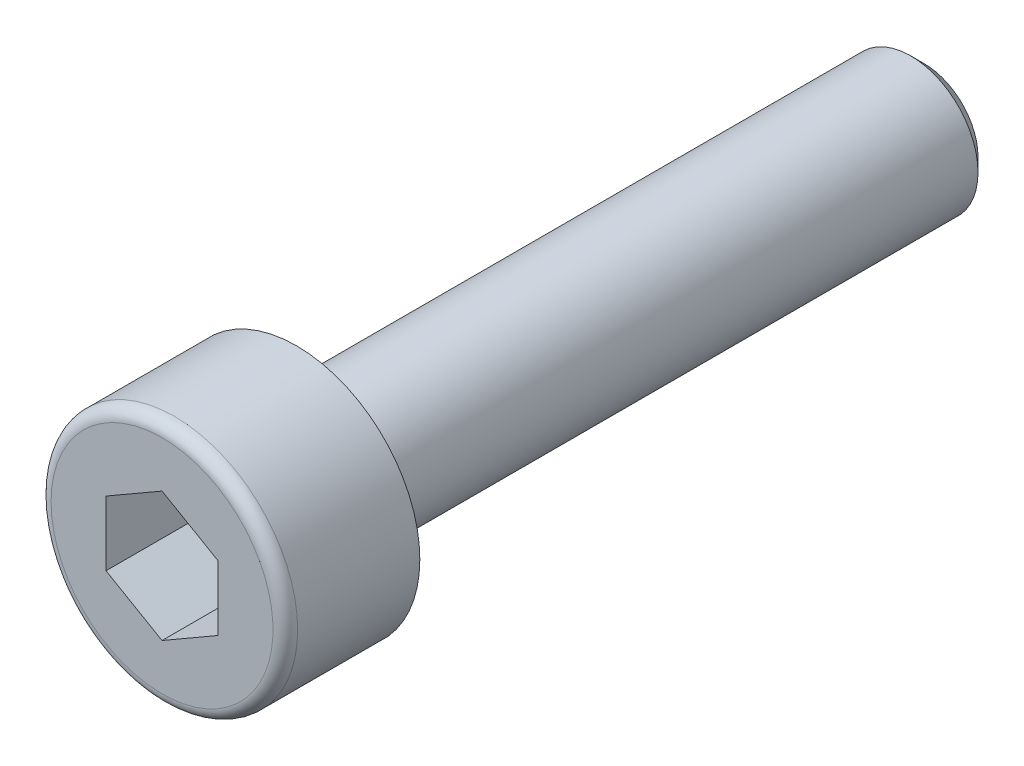
ISO-10303-21;
HEADER;
FILE_DESCRIPTION(('STEP AP214'),'2;1');
FILE_NAME('part.step','',(''),(''),'','','');
FILE_SCHEMA(('AUTOMOTIVE_DESIGN { 1 0 10303 214 1 1 1 1 }'));
ENDSEC;
DATA;
#1=APPLICATION_CONTEXT('core data for automotive mechanical design processes');
#2=APPLICATION_PROTOCOL_DEFINITION('international standard','automotive_design',2000,#1);
#3=PRODUCT_CONTEXT('',#1,'mechanical');
#4=PRODUCT('Part','Part','',(#3));
#5=PRODUCT_RELATED_PRODUCT_CATEGORY('part','',(#4));
#6=PRODUCT_DEFINITION_FORMATION('','',#4);
#7=PRODUCT_DEFINITION_CONTEXT('part definition',#1,'design');
#8=PRODUCT_DEFINITION('design','',#6,#7);
#9=PRODUCT_DEFINITION_SHAPE('','',#8);
#10=(LENGTH_UNIT() NAMED_UNIT(*) SI_UNIT(.MILLI.,.METRE.));
#11=(NAMED_UNIT(*) PLANE_ANGLE_UNIT() SI_UNIT($,.RADIAN.));
#12=(NAMED_UNIT(*) SI_UNIT($,.STERADIAN.) SOLID_ANGLE_UNIT());
#13=UNCERTAINTY_MEASURE_WITH_UNIT(LENGTH_MEASURE(1.E-05),#10,'distance_accuracy_value','');
#14=(GEOMETRIC_REPRESENTATION_CONTEXT(3) GLOBAL_UNCERTAINTY_ASSIGNED_CONTEXT((#13)) GLOBAL_UNIT_ASSIGNED_CONTEXT((#10,
#11,#12)) REPRESENTATION_CONTEXT('',''));
#15=CARTESIAN_POINT('',(0.,0.,0.));
#16=DIRECTION('',(0.,0.,1.));
#17=DIRECTION('',(1.,0.,0.));
#18=AXIS2_PLACEMENT_3D('',#15,#16,#17);
#19=CARTESIAN_POINT('',(0.,0.,3.));
#20=DIRECTION('',(0.,0.,-1.));
#21=DIRECTION('',(-1.,0.,0.));
#22=AXIS2_PLACEMENT_3D('',#19,#20,#21);
#23=PLANE('',#22);
#24=CARTESIAN_POINT('',(0.,0.,3.));
#25=DIRECTION('',(0.,0.,-1.));
#26=DIRECTION('',(-1.,0.,0.));
#27=AXIS2_PLACEMENT_3D('',#24,#25,#26);
#28=CIRCLE('',#27,2.475);
#29=CARTESIAN_POINT('',(-2.475,0.,3.));
#30=VERTEX_POINT('',#29);
#31=EDGE_CURVE('E177',#30,#30,#28,.F.);
#32=ORIENTED_EDGE('',*,*,#31,.T.);
#33=EDGE_LOOP('',(#32));
#34=FACE_BOUND('',#33,.T.);
#35=DIRECTION('',(-0.866025403784439,-0.5,0.));
#36=VECTOR('',#35,1.);
#37=CARTESIAN_POINT('',(0.,1.44337567297406,3.));
#38=LINE('',#37,#36);
#39=CARTESIAN_POINT('',(0.,1.44337567297406,3.));
#40=VERTEX_POINT('',#39);
#41=CARTESIAN_POINT('',(-1.25,0.721687836487032,3.));
#42=VERTEX_POINT('',#41);
#43=EDGE_CURVE('E141',#40,#42,#38,.T.);
#44=ORIENTED_EDGE('',*,*,#43,.F.);
#45=DIRECTION('',(-0.866025403784439,0.5,0.));
#46=VECTOR('',#45,1.);
#47=CARTESIAN_POINT('',(1.25,0.721687836487032,3.));
#48=LINE('',#47,#46);
#49=CARTESIAN_POINT('',(1.25,0.721687836487032,3.));
#50=VERTEX_POINT('',#49);
#51=EDGE_CURVE('E61',#50,#40,#48,.T.);
#52=ORIENTED_EDGE('',*,*,#51,.F.);
#53=DIRECTION('',(0.,1.,0.));
#54=VECTOR('',#53,1.);
#55=CARTESIAN_POINT('',(1.25,-0.721687836487032,3.));
#56=LINE('',#55,#54);
#57=CARTESIAN_POINT('',(1.25,-0.721687836487032,3.));
#58=VERTEX_POINT('',#57);
#59=EDGE_CURVE('E154',#58,#50,#56,.T.);
#60=ORIENTED_EDGE('',*,*,#59,.F.);
#61=DIRECTION('',(0.866025403784439,0.5,0.));
#62=VECTOR('',#61,1.);
#63=CARTESIAN_POINT('',(0.,-1.44337567297406,3.));
#64=LINE('',#63,#62);
#65=CARTESIAN_POINT('',(0.,-1.44337567297406,3.));
#66=VERTEX_POINT('',#65);
#67=EDGE_CURVE('E151',#66,#58,#64,.T.);
#68=ORIENTED_EDGE('',*,*,#67,.F.);
#69=DIRECTION('',(0.866025403784439,-0.5,0.));
#70=VECTOR('',#69,1.);
#71=CARTESIAN_POINT('',(-1.25,-0.721687836487033,3.));
#72=LINE('',#71,#70);
#73=CARTESIAN_POINT('',(-1.25,-0.721687836487033,3.));
#74=VERTEX_POINT('',#73);
#75=EDGE_CURVE('E109',#74,#66,#72,.T.);
#76=ORIENTED_EDGE('',*,*,#75,.F.);
#77=DIRECTION('',(0.,-1.,0.));
#78=VECTOR('',#77,1.);
#79=CARTESIAN_POINT('',(-1.25,0.721687836487032,3.));
#80=LINE('',#79,#78);
#81=EDGE_CURVE('E145',#42,#74,#80,.T.);
#82=ORIENTED_EDGE('',*,*,#81,.F.);
#83=EDGE_LOOP('',(#44,#52,#60,#68,#76,#82));
#84=FACE_BOUND('',#83,.T.);
#85=ADVANCED_FACE('F45',(#34,#84),#23,.F.);
#86=CARTESIAN_POINT('',(0.,0.,3.));
#87=DIRECTION('',(0.,0.,1.));
#88=DIRECTION('',(1.,0.,0.));
#89=AXIS2_PLACEMENT_3D('',#86,#87,#88);
#90=CYLINDRICAL_SURFACE('',#89,2.75);
#91=CARTESIAN_POINT('',(0.,0.,2.725));
#92=DIRECTION('',(0.,0.,-1.));
#93=DIRECTION('',(-1.,0.,0.));
#94=AXIS2_PLACEMENT_3D('',#91,#92,#93);
#95=CIRCLE('',#94,2.75);
#96=CARTESIAN_POINT('',(-2.75,0.,2.725));
#97=VERTEX_POINT('',#96);
#98=EDGE_CURVE('E181',#97,#97,#95,.T.);
#99=ORIENTED_EDGE('',*,*,#98,.T.);
#100=EDGE_LOOP('',(#99));
#101=FACE_BOUND('',#100,.T.);
#102=CARTESIAN_POINT('',(0.,0.,0.));
#103=DIRECTION('',(0.,0.,1.));
#104=DIRECTION('',(1.,0.,0.));
#105=AXIS2_PLACEMENT_3D('',#102,#103,#104);
#106=CIRCLE('',#105,2.75);
#107=CARTESIAN_POINT('',(2.75,0.,0.));
#108=VERTEX_POINT('',#107);
#109=EDGE_CURVE('E173',#108,#108,#106,.T.);
#110=ORIENTED_EDGE('',*,*,#109,.T.);
#111=EDGE_LOOP('',(#110));
#112=FACE_BOUND('',#111,.T.);
#113=ADVANCED_FACE('F201',(#101,#112),#90,.T.);
#114=CARTESIAN_POINT('',(0.,2.75,0.));
#115=DIRECTION('',(0.,0.,1.));
#116=DIRECTION('',(1.,0.,0.));
#117=AXIS2_PLACEMENT_3D('',#114,#115,#116);
#118=PLANE('',#117);
#119=ORIENTED_EDGE('',*,*,#109,.F.);
#120=EDGE_LOOP('',(#119));
#121=FACE_BOUND('',#120,.T.);
#122=CARTESIAN_POINT('',(0.,0.,0.));
#123=DIRECTION('',(0.,0.,1.));
#124=DIRECTION('',(1.,0.,0.));
#125=AXIS2_PLACEMENT_3D('',#122,#123,#124);
#126=CIRCLE('',#125,1.5);
#127=CARTESIAN_POINT('',(1.5,0.,0.));
#128=VERTEX_POINT('',#127);
#129=EDGE_CURVE('E160',#128,#128,#126,.T.);
#130=ORIENTED_EDGE('',*,*,#129,.T.);
#131=EDGE_LOOP('',(#130));
#132=FACE_BOUND('',#131,.T.);
#133=ADVANCED_FACE('F208',(#121,#132),#118,.F.);
#134=CARTESIAN_POINT('',(0.,0.,3.));
#135=DIRECTION('',(0.,0.,1.));
#136=DIRECTION('',(1.,0.,0.));
#137=AXIS2_PLACEMENT_3D('',#134,#135,#136);
#138=CYLINDRICAL_SURFACE('',#137,1.5);
#139=CARTESIAN_POINT('',(0.,0.,-13.7));
#140=DIRECTION('',(0.,0.,1.));
#141=DIRECTION('',(1.,0.,0.));
#142=AXIS2_PLACEMENT_3D('',#139,#140,#141);
#143=CIRCLE('',#142,1.5);
#144=CARTESIAN_POINT('',(1.5,0.,-13.7));
#145=VERTEX_POINT('',#144);
#146=EDGE_CURVE('E54',#145,#145,#143,.T.);
#147=ORIENTED_EDGE('',*,*,#146,.T.);
#148=EDGE_LOOP('',(#147));
#149=FACE_BOUND('',#148,.T.);
#150=ORIENTED_EDGE('',*,*,#129,.F.);
#151=EDGE_LOOP('',(#150));
#152=FACE_BOUND('',#151,.T.);
#153=ADVANCED_FACE('F188',(#149,#152),#138,.T.);
#154=CARTESIAN_POINT('',(0.,1.5,-14.));
#155=DIRECTION('',(0.,0.,1.));
#156=DIRECTION('',(1.,0.,0.));
#157=AXIS2_PLACEMENT_3D('',#154,#155,#156);
#158=PLANE('',#157);
#159=CARTESIAN_POINT('',(0.,0.,-14.));
#160=DIRECTION('',(0.,0.,1.));
#161=DIRECTION('',(1.,0.,0.));
#162=AXIS2_PLACEMENT_3D('',#159,#160,#161);
#163=CIRCLE('',#162,1.2);
#164=CARTESIAN_POINT('',(1.2,0.,-14.));
#165=VERTEX_POINT('',#164);
#166=EDGE_CURVE('E11',#165,#165,#163,.F.);
#167=ORIENTED_EDGE('',*,*,#166,.T.);
#168=EDGE_LOOP('',(#167));
#169=FACE_BOUND('',#168,.T.);
#170=ADVANCED_FACE('F218',(#169),#158,.F.);
#171=CARTESIAN_POINT('',(1.25,0.721687836487032,1.075));
#172=DIRECTION('',(0.5,0.866025403784439,0.));
#173=DIRECTION('',(-0.866025403784439,0.5,0.));
#174=AXIS2_PLACEMENT_3D('',#171,#172,#173);
#175=PLANE('',#174);
#176=ORIENTED_EDGE('',*,*,#51,.T.);
#177=DIRECTION('',(0.,0.,1.));
#178=VECTOR('',#177,1.);
#179=CARTESIAN_POINT('',(0.,1.44337567297406,1.075));
#180=LINE('',#179,#178);
#181=CARTESIAN_POINT('',(0.,1.44337567297406,1.075));
#182=VERTEX_POINT('',#181);
#183=EDGE_CURVE('E91',#182,#40,#180,.T.);
#184=ORIENTED_EDGE('',*,*,#183,.F.);
#185=DIRECTION('',(-0.866025403784439,0.5,0.));
#186=VECTOR('',#185,1.);
#187=CARTESIAN_POINT('',(1.25,0.721687836487032,1.075));
#188=LINE('',#187,#186);
#189=CARTESIAN_POINT('',(1.25,0.721687836487032,1.075));
#190=VERTEX_POINT('',#189);
#191=EDGE_CURVE('E157',#190,#182,#188,.T.);
#192=ORIENTED_EDGE('',*,*,#191,.F.);
#193=DIRECTION('',(0.,0.,1.));
#194=VECTOR('',#193,1.);
#195=CARTESIAN_POINT('',(1.25,0.721687836487032,1.075));
#196=LINE('',#195,#194);
#197=EDGE_CURVE('E69',#190,#50,#196,.T.);
#198=ORIENTED_EDGE('',*,*,#197,.T.);
#199=EDGE_LOOP('',(#176,#184,#192,#198));
#200=FACE_BOUND('',#199,.T.);
#201=ADVANCED_FACE('F220',(#200),#175,.F.);
#202=CARTESIAN_POINT('',(1.25,-0.721687836487032,1.075));
#203=DIRECTION('',(1.,0.,0.));
#204=DIRECTION('',(0.,0.,-1.));
#205=AXIS2_PLACEMENT_3D('',#202,#203,#204);
#206=PLANE('',#205);
#207=ORIENTED_EDGE('',*,*,#59,.T.);
#208=ORIENTED_EDGE('',*,*,#197,.F.);
#209=DIRECTION('',(0.,1.,0.));
#210=VECTOR('',#209,1.);
#211=CARTESIAN_POINT('',(1.25,-0.721687836487032,1.075));
#212=LINE('',#211,#210);
#213=CARTESIAN_POINT('',(1.25,-0.721687836487032,1.075));
#214=VERTEX_POINT('',#213);
#215=EDGE_CURVE('E123',#214,#190,#212,.T.);
#216=ORIENTED_EDGE('',*,*,#215,.F.);
#217=DIRECTION('',(0.,0.,1.));
#218=VECTOR('',#217,1.);
#219=CARTESIAN_POINT('',(1.25,-0.721687836487032,1.075));
#220=LINE('',#219,#218);
#221=EDGE_CURVE('E114',#214,#58,#220,.T.);
#222=ORIENTED_EDGE('',*,*,#221,.T.);
#223=EDGE_LOOP('',(#207,#208,#216,#222));
#224=FACE_BOUND('',#223,.T.);
#225=ADVANCED_FACE('F224',(#224),#206,.F.);
#226=CARTESIAN_POINT('',(0.,-1.44337567297406,1.075));
#227=DIRECTION('',(0.5,-0.866025403784439,0.));
#228=DIRECTION('',(0.866025403784439,0.5,0.));
#229=AXIS2_PLACEMENT_3D('',#226,#227,#228);
#230=PLANE('',#229);
#231=ORIENTED_EDGE('',*,*,#67,.T.);
#232=ORIENTED_EDGE('',*,*,#221,.F.);
#233=DIRECTION('',(0.866025403784439,0.5,0.));
#234=VECTOR('',#233,1.);
#235=CARTESIAN_POINT('',(0.,-1.44337567297406,1.075));
#236=LINE('',#235,#234);
#237=CARTESIAN_POINT('',(0.,-1.44337567297406,1.075));
#238=VERTEX_POINT('',#237);
#239=EDGE_CURVE('E118',#238,#214,#236,.T.);
#240=ORIENTED_EDGE('',*,*,#239,.F.);
#241=DIRECTION('',(0.,0.,1.));
#242=VECTOR('',#241,1.);
#243=CARTESIAN_POINT('',(0.,-1.44337567297406,1.075));
#244=LINE('',#243,#242);
#245=EDGE_CURVE('E102',#238,#66,#244,.T.);
#246=ORIENTED_EDGE('',*,*,#245,.T.);
#247=EDGE_LOOP('',(#231,#232,#240,#246));
#248=FACE_BOUND('',#247,.T.);
#249=ADVANCED_FACE('F119',(#248),#230,.F.);
#250=CARTESIAN_POINT('',(-1.25,-0.721687836487033,1.075));
#251=DIRECTION('',(-0.5,-0.866025403784439,0.));
#252=DIRECTION('',(0.866025403784439,-0.5,0.));
#253=AXIS2_PLACEMENT_3D('',#250,#251,#252);
#254=PLANE('',#253);
#255=ORIENTED_EDGE('',*,*,#75,.T.);
#256=ORIENTED_EDGE('',*,*,#245,.F.);
#257=DIRECTION('',(0.866025403784439,-0.5,0.));
#258=VECTOR('',#257,1.);
#259=CARTESIAN_POINT('',(-1.25,-0.721687836487033,1.075));
#260=LINE('',#259,#258);
#261=CARTESIAN_POINT('',(-1.25,-0.721687836487033,1.075));
#262=VERTEX_POINT('',#261);
#263=EDGE_CURVE('E106',#262,#238,#260,.T.);
#264=ORIENTED_EDGE('',*,*,#263,.F.);
#265=DIRECTION('',(0.,0.,1.));
#266=VECTOR('',#265,1.);
#267=CARTESIAN_POINT('',(-1.25,-0.721687836487033,1.075));
#268=LINE('',#267,#266);
#269=EDGE_CURVE('E115',#262,#74,#268,.T.);
#270=ORIENTED_EDGE('',*,*,#269,.T.);
#271=EDGE_LOOP('',(#255,#256,#264,#270));
#272=FACE_BOUND('',#271,.T.);
#273=ADVANCED_FACE('F104',(#272),#254,.F.);
#274=CARTESIAN_POINT('',(-1.25,0.721687836487032,1.075));
#275=DIRECTION('',(-1.,0.,0.));
#276=DIRECTION('',(0.,-1.,0.));
#277=AXIS2_PLACEMENT_3D('',#274,#275,#276);
#278=PLANE('',#277);
#279=ORIENTED_EDGE('',*,*,#81,.T.);
#280=ORIENTED_EDGE('',*,*,#269,.F.);
#281=DIRECTION('',(0.,-1.,0.));
#282=VECTOR('',#281,1.);
#283=CARTESIAN_POINT('',(-1.25,0.721687836487032,1.075));
#284=LINE('',#283,#282);
#285=CARTESIAN_POINT('',(-1.25,0.721687836487032,1.075));
#286=VERTEX_POINT('',#285);
#287=EDGE_CURVE('E129',#286,#262,#284,.T.);
#288=ORIENTED_EDGE('',*,*,#287,.F.);
#289=DIRECTION('',(0.,0.,1.));
#290=VECTOR('',#289,1.);
#291=CARTESIAN_POINT('',(-1.25,0.721687836487032,1.075));
#292=LINE('',#291,#290);
#293=EDGE_CURVE('E165',#286,#42,#292,.T.);
#294=ORIENTED_EDGE('',*,*,#293,.T.);
#295=EDGE_LOOP('',(#279,#280,#288,#294));
#296=FACE_BOUND('',#295,.T.);
#297=ADVANCED_FACE('F228',(#296),#278,.F.);
#298=CARTESIAN_POINT('',(0.,1.44337567297406,1.075));
#299=DIRECTION('',(-0.5,0.866025403784439,0.));
#300=DIRECTION('',(-0.866025403784439,-0.5,0.));
#301=AXIS2_PLACEMENT_3D('',#298,#299,#300);
#302=PLANE('',#301);
#303=ORIENTED_EDGE('',*,*,#43,.T.);
#304=ORIENTED_EDGE('',*,*,#293,.F.);
#305=DIRECTION('',(-0.866025403784439,-0.5,0.));
#306=VECTOR('',#305,1.);
#307=CARTESIAN_POINT('',(0.,1.44337567297406,1.075));
#308=LINE('',#307,#306);
#309=EDGE_CURVE('E133',#182,#286,#308,.T.);
#310=ORIENTED_EDGE('',*,*,#309,.F.);
#311=ORIENTED_EDGE('',*,*,#183,.T.);
#312=EDGE_LOOP('',(#303,#304,#310,#311));
#313=FACE_BOUND('',#312,.T.);
#314=ADVANCED_FACE('F225',(#313),#302,.F.);
#315=CARTESIAN_POINT('',(0.,1.44337567297406,1.075));
#316=DIRECTION('',(0.,0.,1.));
#317=DIRECTION('',(1.,0.,0.));
#318=AXIS2_PLACEMENT_3D('',#315,#316,#317);
#319=PLANE('',#318);
#320=ORIENTED_EDGE('',*,*,#191,.T.);
#321=ORIENTED_EDGE('',*,*,#309,.T.);
#322=ORIENTED_EDGE('',*,*,#287,.T.);
#323=ORIENTED_EDGE('',*,*,#263,.T.);
#324=ORIENTED_EDGE('',*,*,#239,.T.);
#325=ORIENTED_EDGE('',*,*,#215,.T.);
#326=EDGE_LOOP('',(#320,#321,#322,#323,#324,#325));
#327=FACE_BOUND('',#326,.T.);
#328=ADVANCED_FACE('F126',(#327),#319,.T.);
#329=CARTESIAN_POINT('',(0.,0.,2.725));
#330=DIRECTION('',(0.,0.,-1.));
#331=DIRECTION('',(-1.,0.,0.));
#332=AXIS2_PLACEMENT_3D('',#329,#330,#331);
#333=TOROIDAL_SURFACE('',#332,2.475,0.275);
#334=ORIENTED_EDGE('',*,*,#98,.F.);
#335=EDGE_LOOP('',(#334));
#336=FACE_BOUND('',#335,.T.);
#337=ORIENTED_EDGE('',*,*,#31,.F.);
#338=EDGE_LOOP('',(#337));
#339=FACE_BOUND('',#338,.T.);
#340=ADVANCED_FACE('F192',(#336,#339),#333,.T.);
#341=CARTESIAN_POINT('',(0.,0.,-13.7));
#342=DIRECTION('',(0.,0.,1.));
#343=DIRECTION('',(1.,0.,0.));
#344=AXIS2_PLACEMENT_3D('',#341,#342,#343);
#345=CONICAL_SURFACE('',#344,1.5,0.785398163397458);
#346=ORIENTED_EDGE('',*,*,#166,.F.);
#347=EDGE_LOOP('',(#346));
#348=FACE_BOUND('',#347,.T.);
#349=ORIENTED_EDGE('',*,*,#146,.F.);
#350=EDGE_LOOP('',(#349));
#351=FACE_BOUND('',#350,.T.);
#352=ADVANCED_FACE('F47',(#348,#351),#345,.T.);
#353=CLOSED_SHELL('',(#85,#113,#133,#153,#170,#201,#225,#249,#273,#297,#314,#328,#340,#352));
#354=MANIFOLD_SOLID_BREP('B2',#353);
#355=ADVANCED_BREP_SHAPE_REPRESENTATION('',(#18,#354),#14);
#356=SHAPE_DEFINITION_REPRESENTATION(#9,#355);
ENDSEC;
END-ISO-10303-21;
